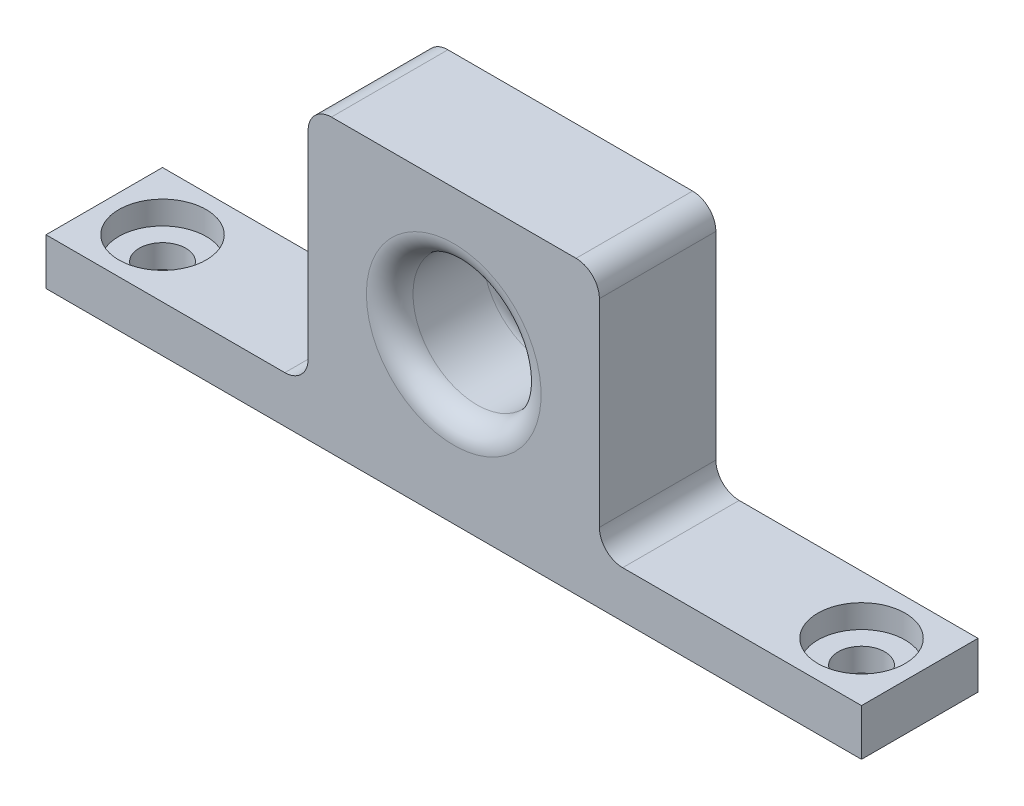
ISO-10303-21;
HEADER;
FILE_DESCRIPTION(('STEP AP214'),'2;1');
FILE_NAME('part.step','',(''),(''),'','','');
FILE_SCHEMA(('AUTOMOTIVE_DESIGN { 1 0 10303 214 1 1 1 1 }'));
ENDSEC;
DATA;
#1=APPLICATION_CONTEXT('core data for automotive mechanical design processes');
#2=APPLICATION_PROTOCOL_DEFINITION('international standard','automotive_design',2000,#1);
#3=PRODUCT_CONTEXT('',#1,'mechanical');
#4=PRODUCT('Part','Part','',(#3));
#5=PRODUCT_RELATED_PRODUCT_CATEGORY('part','',(#4));
#6=PRODUCT_DEFINITION_FORMATION('','',#4);
#7=PRODUCT_DEFINITION_CONTEXT('part definition',#1,'design');
#8=PRODUCT_DEFINITION('design','',#6,#7);
#9=PRODUCT_DEFINITION_SHAPE('','',#8);
#10=(LENGTH_UNIT() NAMED_UNIT(*) SI_UNIT(.MILLI.,.METRE.));
#11=(NAMED_UNIT(*) PLANE_ANGLE_UNIT() SI_UNIT($,.RADIAN.));
#12=(NAMED_UNIT(*) SI_UNIT($,.STERADIAN.) SOLID_ANGLE_UNIT());
#13=UNCERTAINTY_MEASURE_WITH_UNIT(LENGTH_MEASURE(1.E-05),#10,'distance_accuracy_value','');
#14=(GEOMETRIC_REPRESENTATION_CONTEXT(3) GLOBAL_UNCERTAINTY_ASSIGNED_CONTEXT((#13)) GLOBAL_UNIT_ASSIGNED_CONTEXT((#10,
#11,#12)) REPRESENTATION_CONTEXT('',''));
#15=CARTESIAN_POINT('',(0.,0.,0.));
#16=DIRECTION('',(0.,0.,1.));
#17=DIRECTION('',(1.,0.,0.));
#18=AXIS2_PLACEMENT_3D('',#15,#16,#17);
#19=CARTESIAN_POINT('',(0.,5.08,0.));
#20=DIRECTION('',(0.,-1.,0.));
#21=DIRECTION('',(0.,0.,-1.));
#22=AXIS2_PLACEMENT_3D('',#19,#20,#21);
#23=PLANE('',#22);
#24=CARTESIAN_POINT('',(6.34999999999999,5.08,-6.35));
#25=DIRECTION('',(0.,1.,0.));
#26=DIRECTION('',(0.,0.,1.));
#27=AXIS2_PLACEMENT_3D('',#24,#25,#26);
#28=CIRCLE('',#27,4.7625);
#29=CARTESIAN_POINT('',(6.34999999999999,5.08,-1.5875));
#30=VERTEX_POINT('',#29);
#31=EDGE_CURVE('E285',#30,#30,#28,.T.);
#32=ORIENTED_EDGE('',*,*,#31,.F.);
#33=EDGE_LOOP('',(#32));
#34=FACE_BOUND('',#33,.T.);
#35=DIRECTION('',(1.,0.,0.));
#36=VECTOR('',#35,1.);
#37=CARTESIAN_POINT('',(0.,5.08,0.));
#38=LINE('',#37,#36);
#39=CARTESIAN_POINT('',(0.,5.08,0.));
#40=VERTEX_POINT('',#39);
#41=CARTESIAN_POINT('',(26.035,5.08,0.));
#42=VERTEX_POINT('',#41);
#43=EDGE_CURVE('E129',#40,#42,#38,.T.);
#44=ORIENTED_EDGE('',*,*,#43,.T.);
#45=DIRECTION('',(0.,0.,-1.));
#46=VECTOR('',#45,1.);
#47=CARTESIAN_POINT('',(26.035,5.08,0.));
#48=LINE('',#47,#46);
#49=CARTESIAN_POINT('',(26.035,5.08,-12.7));
#50=VERTEX_POINT('',#49);
#51=EDGE_CURVE('E207',#42,#50,#48,.T.);
#52=ORIENTED_EDGE('',*,*,#51,.T.);
#53=DIRECTION('',(-1.,0.,0.));
#54=VECTOR('',#53,1.);
#55=CARTESIAN_POINT('',(0.,5.08,-12.7));
#56=LINE('',#55,#54);
#57=CARTESIAN_POINT('',(0.,5.08,-12.7));
#58=VERTEX_POINT('',#57);
#59=EDGE_CURVE('E147',#50,#58,#56,.T.);
#60=ORIENTED_EDGE('',*,*,#59,.T.);
#61=DIRECTION('',(0.,0.,1.));
#62=VECTOR('',#61,1.);
#63=CARTESIAN_POINT('',(0.,5.08,0.));
#64=LINE('',#63,#62);
#65=EDGE_CURVE('E145',#58,#40,#64,.T.);
#66=ORIENTED_EDGE('',*,*,#65,.T.);
#67=EDGE_LOOP('',(#44,#52,#60,#66));
#68=FACE_BOUND('',#67,.T.);
#69=ADVANCED_FACE('F39',(#34,#68),#23,.F.);
#70=CARTESIAN_POINT('',(6.34999999999999,5.08,-6.35));
#71=DIRECTION('',(0.,-1.,0.));
#72=DIRECTION('',(0.,0.,-1.));
#73=AXIS2_PLACEMENT_3D('',#70,#71,#72);
#74=CYLINDRICAL_SURFACE('',#73,2.54);
#75=CARTESIAN_POINT('',(6.34999999999999,0.,-6.35));
#76=DIRECTION('',(0.,1.,0.));
#77=DIRECTION('',(0.,0.,1.));
#78=AXIS2_PLACEMENT_3D('',#75,#76,#77);
#79=CIRCLE('',#78,2.54);
#80=CARTESIAN_POINT('',(6.34999999999999,0.,-3.81));
#81=VERTEX_POINT('',#80);
#82=EDGE_CURVE('E295',#81,#81,#79,.T.);
#83=ORIENTED_EDGE('',*,*,#82,.F.);
#84=EDGE_LOOP('',(#83));
#85=FACE_BOUND('',#84,.T.);
#86=CARTESIAN_POINT('',(6.34999999999999,2.54,-6.35));
#87=DIRECTION('',(0.,1.,0.));
#88=DIRECTION('',(0.,0.,1.));
#89=AXIS2_PLACEMENT_3D('',#86,#87,#88);
#90=CIRCLE('',#89,2.54);
#91=CARTESIAN_POINT('',(6.34999999999999,2.54,-3.81));
#92=VERTEX_POINT('',#91);
#93=EDGE_CURVE('E170',#92,#92,#90,.T.);
#94=ORIENTED_EDGE('',*,*,#93,.T.);
#95=EDGE_LOOP('',(#94));
#96=FACE_BOUND('',#95,.T.);
#97=ADVANCED_FACE('F233',(#85,#96),#74,.F.);
#98=CARTESIAN_POINT('',(82.55,5.08,-6.35));
#99=DIRECTION('',(0.,-1.,0.));
#100=DIRECTION('',(0.,0.,-1.));
#101=AXIS2_PLACEMENT_3D('',#98,#99,#100);
#102=CYLINDRICAL_SURFACE('',#101,2.54);
#103=CARTESIAN_POINT('',(82.55,0.,-6.35));
#104=DIRECTION('',(0.,1.,0.));
#105=DIRECTION('',(0.,0.,1.));
#106=AXIS2_PLACEMENT_3D('',#103,#104,#105);
#107=CIRCLE('',#106,2.54);
#108=CARTESIAN_POINT('',(82.55,0.,-3.81));
#109=VERTEX_POINT('',#108);
#110=EDGE_CURVE('E173',#109,#109,#107,.T.);
#111=ORIENTED_EDGE('',*,*,#110,.F.);
#112=EDGE_LOOP('',(#111));
#113=FACE_BOUND('',#112,.T.);
#114=CARTESIAN_POINT('',(82.55,2.54,-6.35));
#115=DIRECTION('',(0.,1.,0.));
#116=DIRECTION('',(0.,0.,1.));
#117=AXIS2_PLACEMENT_3D('',#114,#115,#116);
#118=CIRCLE('',#117,2.54);
#119=CARTESIAN_POINT('',(82.55,2.54,-3.81));
#120=VERTEX_POINT('',#119);
#121=EDGE_CURVE('E167',#120,#120,#118,.T.);
#122=ORIENTED_EDGE('',*,*,#121,.T.);
#123=EDGE_LOOP('',(#122));
#124=FACE_BOUND('',#123,.T.);
#125=ADVANCED_FACE('F240',(#113,#124),#102,.F.);
#126=CARTESIAN_POINT('',(82.55,5.08,-6.35));
#127=DIRECTION('',(0.,1.,0.));
#128=DIRECTION('',(0.,0.,1.));
#129=AXIS2_PLACEMENT_3D('',#126,#127,#128);
#130=CIRCLE('',#129,4.7625);
#131=CARTESIAN_POINT('',(82.55,5.08,-1.5875));
#132=VERTEX_POINT('',#131);
#133=EDGE_CURVE('E258',#132,#132,#130,.T.);
#134=ORIENTED_EDGE('',*,*,#133,.F.);
#135=EDGE_LOOP('',(#134));
#136=FACE_BOUND('',#135,.T.);
#137=CARTESIAN_POINT('',(88.9,5.08,-12.7));
#138=VERTEX_POINT('',#137);
#139=CARTESIAN_POINT('',(62.865,5.08,-12.7));
#140=VERTEX_POINT('',#139);
#141=EDGE_CURVE('E259',#138,#140,#56,.T.);
#142=ORIENTED_EDGE('',*,*,#141,.T.);
#143=DIRECTION('',(0.,0.,1.));
#144=VECTOR('',#143,1.);
#145=CARTESIAN_POINT('',(62.865,5.08,0.));
#146=LINE('',#145,#144);
#147=CARTESIAN_POINT('',(62.865,5.08,0.));
#148=VERTEX_POINT('',#147);
#149=EDGE_CURVE('E190',#140,#148,#146,.T.);
#150=ORIENTED_EDGE('',*,*,#149,.T.);
#151=CARTESIAN_POINT('',(88.9,5.08,0.));
#152=VERTEX_POINT('',#151);
#153=EDGE_CURVE('E142',#148,#152,#38,.T.);
#154=ORIENTED_EDGE('',*,*,#153,.T.);
#155=DIRECTION('',(0.,0.,-1.));
#156=VECTOR('',#155,1.);
#157=CARTESIAN_POINT('',(88.9,5.08,0.));
#158=LINE('',#157,#156);
#159=EDGE_CURVE('E141',#152,#138,#158,.T.);
#160=ORIENTED_EDGE('',*,*,#159,.T.);
#161=EDGE_LOOP('',(#142,#150,#154,#160));
#162=FACE_BOUND('',#161,.T.);
#163=ADVANCED_FACE('F236',(#136,#162),#23,.F.);
#164=CARTESIAN_POINT('',(0.,0.,0.));
#165=DIRECTION('',(0.,-1.,0.));
#166=DIRECTION('',(0.,0.,-1.));
#167=AXIS2_PLACEMENT_3D('',#164,#165,#166);
#168=PLANE('',#167);
#169=DIRECTION('',(0.,0.,-1.));
#170=VECTOR('',#169,1.);
#171=CARTESIAN_POINT('',(88.9,0.,0.));
#172=LINE('',#171,#170);
#173=CARTESIAN_POINT('',(88.9,0.,0.));
#174=VERTEX_POINT('',#173);
#175=CARTESIAN_POINT('',(88.9,0.,-12.7));
#176=VERTEX_POINT('',#175);
#177=EDGE_CURVE('E302',#174,#176,#172,.T.);
#178=ORIENTED_EDGE('',*,*,#177,.F.);
#179=DIRECTION('',(1.,0.,0.));
#180=VECTOR('',#179,1.);
#181=CARTESIAN_POINT('',(0.,0.,0.));
#182=LINE('',#181,#180);
#183=CARTESIAN_POINT('',(0.,0.,0.));
#184=VERTEX_POINT('',#183);
#185=EDGE_CURVE('E300',#184,#174,#182,.T.);
#186=ORIENTED_EDGE('',*,*,#185,.F.);
#187=DIRECTION('',(0.,0.,1.));
#188=VECTOR('',#187,1.);
#189=CARTESIAN_POINT('',(0.,0.,0.));
#190=LINE('',#189,#188);
#191=CARTESIAN_POINT('',(0.,0.,-12.7));
#192=VERTEX_POINT('',#191);
#193=EDGE_CURVE('E155',#192,#184,#190,.T.);
#194=ORIENTED_EDGE('',*,*,#193,.F.);
#195=DIRECTION('',(-1.,0.,0.));
#196=VECTOR('',#195,1.);
#197=CARTESIAN_POINT('',(0.,0.,-12.7));
#198=LINE('',#197,#196);
#199=EDGE_CURVE('E151',#176,#192,#198,.T.);
#200=ORIENTED_EDGE('',*,*,#199,.F.);
#201=EDGE_LOOP('',(#178,#186,#194,#200));
#202=FACE_BOUND('',#201,.T.);
#203=ORIENTED_EDGE('',*,*,#110,.T.);
#204=EDGE_LOOP('',(#203));
#205=FACE_BOUND('',#204,.T.);
#206=ORIENTED_EDGE('',*,*,#82,.T.);
#207=EDGE_LOOP('',(#206));
#208=FACE_BOUND('',#207,.T.);
#209=ADVANCED_FACE('F246',(#202,#205,#208),#168,.T.);
#210=CARTESIAN_POINT('',(0.,5.08,0.));
#211=DIRECTION('',(1.,0.,0.));
#212=DIRECTION('',(0.,0.,-1.));
#213=AXIS2_PLACEMENT_3D('',#210,#211,#212);
#214=PLANE('',#213);
#215=ORIENTED_EDGE('',*,*,#193,.T.);
#216=DIRECTION('',(0.,-1.,0.));
#217=VECTOR('',#216,1.);
#218=CARTESIAN_POINT('',(0.,5.08,0.));
#219=LINE('',#218,#217);
#220=EDGE_CURVE('E134',#40,#184,#219,.T.);
#221=ORIENTED_EDGE('',*,*,#220,.F.);
#222=ORIENTED_EDGE('',*,*,#65,.F.);
#223=DIRECTION('',(0.,-1.,0.));
#224=VECTOR('',#223,1.);
#225=CARTESIAN_POINT('',(0.,5.08,-12.7));
#226=LINE('',#225,#224);
#227=EDGE_CURVE('E265',#58,#192,#226,.T.);
#228=ORIENTED_EDGE('',*,*,#227,.T.);
#229=EDGE_LOOP('',(#215,#221,#222,#228));
#230=FACE_BOUND('',#229,.T.);
#231=ADVANCED_FACE('F153',(#230),#214,.F.);
#232=CARTESIAN_POINT('',(0.,5.08,0.));
#233=DIRECTION('',(0.,0.,-1.));
#234=DIRECTION('',(-1.,0.,0.));
#235=AXIS2_PLACEMENT_3D('',#232,#233,#234);
#236=PLANE('',#235);
#237=CARTESIAN_POINT('',(44.45,16.9545,0.));
#238=DIRECTION('',(0.,0.,-1.));
#239=DIRECTION('',(-1.,0.,0.));
#240=AXIS2_PLACEMENT_3D('',#237,#238,#239);
#241=CIRCLE('',#240,9.525);
#242=CARTESIAN_POINT('',(34.925,16.9545,0.));
#243=VERTEX_POINT('',#242);
#244=EDGE_CURVE('E181',#243,#243,#241,.T.);
#245=ORIENTED_EDGE('',*,*,#244,.T.);
#246=EDGE_LOOP('',(#245));
#247=FACE_BOUND('',#246,.T.);
#248=DIRECTION('',(0.,1.,0.));
#249=VECTOR('',#248,1.);
#250=CARTESIAN_POINT('',(60.325,31.75,0.));
#251=LINE('',#250,#249);
#252=CARTESIAN_POINT('',(60.325,7.62,0.));
#253=VERTEX_POINT('',#252);
#254=CARTESIAN_POINT('',(60.325,29.21,0.));
#255=VERTEX_POINT('',#254);
#256=EDGE_CURVE('E271',#253,#255,#251,.T.);
#257=ORIENTED_EDGE('',*,*,#256,.T.);
#258=CARTESIAN_POINT('',(57.785,29.21,0.));
#259=DIRECTION('',(0.,0.,-1.));
#260=DIRECTION('',(-1.,0.,0.));
#261=AXIS2_PLACEMENT_3D('',#258,#259,#260);
#262=CIRCLE('',#261,2.54);
#263=CARTESIAN_POINT('',(57.785,31.75,0.));
#264=VERTEX_POINT('',#263);
#265=EDGE_CURVE('E179',#255,#264,#262,.F.);
#266=ORIENTED_EDGE('',*,*,#265,.T.);
#267=DIRECTION('',(-1.,0.,0.));
#268=VECTOR('',#267,1.);
#269=CARTESIAN_POINT('',(28.575,31.75,0.));
#270=LINE('',#269,#268);
#271=CARTESIAN_POINT('',(31.115,31.75,0.));
#272=VERTEX_POINT('',#271);
#273=EDGE_CURVE('E223',#264,#272,#270,.T.);
#274=ORIENTED_EDGE('',*,*,#273,.T.);
#275=CARTESIAN_POINT('',(31.115,29.21,0.));
#276=DIRECTION('',(0.,0.,-1.));
#277=DIRECTION('',(-1.,0.,0.));
#278=AXIS2_PLACEMENT_3D('',#275,#276,#277);
#279=CIRCLE('',#278,2.54);
#280=CARTESIAN_POINT('',(28.575,29.21,0.));
#281=VERTEX_POINT('',#280);
#282=EDGE_CURVE('E177',#272,#281,#279,.F.);
#283=ORIENTED_EDGE('',*,*,#282,.T.);
#284=DIRECTION('',(0.,-1.,0.));
#285=VECTOR('',#284,1.);
#286=CARTESIAN_POINT('',(28.575,31.75,0.));
#287=LINE('',#286,#285);
#288=CARTESIAN_POINT('',(28.575,7.62,0.));
#289=VERTEX_POINT('',#288);
#290=EDGE_CURVE('E276',#281,#289,#287,.T.);
#291=ORIENTED_EDGE('',*,*,#290,.T.);
#292=CARTESIAN_POINT('',(26.035,7.62,0.));
#293=DIRECTION('',(0.,0.,-1.));
#294=DIRECTION('',(-1.,0.,0.));
#295=AXIS2_PLACEMENT_3D('',#292,#293,#294);
#296=CIRCLE('',#295,2.54);
#297=EDGE_CURVE('E11',#289,#42,#296,.T.);
#298=ORIENTED_EDGE('',*,*,#297,.T.);
#299=ORIENTED_EDGE('',*,*,#43,.F.);
#300=ORIENTED_EDGE('',*,*,#220,.T.);
#301=ORIENTED_EDGE('',*,*,#185,.T.);
#302=DIRECTION('',(0.,-1.,0.));
#303=VECTOR('',#302,1.);
#304=CARTESIAN_POINT('',(88.9,5.08,0.));
#305=LINE('',#304,#303);
#306=EDGE_CURVE('E157',#152,#174,#305,.T.);
#307=ORIENTED_EDGE('',*,*,#306,.F.);
#308=ORIENTED_EDGE('',*,*,#153,.F.);
#309=CARTESIAN_POINT('',(62.865,7.62,0.));
#310=DIRECTION('',(0.,0.,-1.));
#311=DIRECTION('',(-1.,0.,0.));
#312=AXIS2_PLACEMENT_3D('',#309,#310,#311);
#313=CIRCLE('',#312,2.54);
#314=EDGE_CURVE('E209',#148,#253,#313,.T.);
#315=ORIENTED_EDGE('',*,*,#314,.T.);
#316=EDGE_LOOP('',(#257,#266,#274,#283,#291,#298,#299,#300,#301,#307,#308,#315));
#317=FACE_BOUND('',#316,.T.);
#318=ADVANCED_FACE('F132',(#247,#317),#236,.F.);
#319=CARTESIAN_POINT('',(88.9,5.08,0.));
#320=DIRECTION('',(-1.,0.,0.));
#321=DIRECTION('',(0.,0.,1.));
#322=AXIS2_PLACEMENT_3D('',#319,#320,#321);
#323=PLANE('',#322);
#324=ORIENTED_EDGE('',*,*,#177,.T.);
#325=DIRECTION('',(0.,-1.,0.));
#326=VECTOR('',#325,1.);
#327=CARTESIAN_POINT('',(88.9,5.08,-12.7));
#328=LINE('',#327,#326);
#329=EDGE_CURVE('E163',#138,#176,#328,.T.);
#330=ORIENTED_EDGE('',*,*,#329,.F.);
#331=ORIENTED_EDGE('',*,*,#159,.F.);
#332=ORIENTED_EDGE('',*,*,#306,.T.);
#333=EDGE_LOOP('',(#324,#330,#331,#332));
#334=FACE_BOUND('',#333,.T.);
#335=ADVANCED_FACE('F309',(#334),#323,.F.);
#336=CARTESIAN_POINT('',(0.,5.08,-12.7));
#337=DIRECTION('',(0.,0.,1.));
#338=DIRECTION('',(1.,0.,0.));
#339=AXIS2_PLACEMENT_3D('',#336,#337,#338);
#340=PLANE('',#339);
#341=CARTESIAN_POINT('',(44.45,16.9545,-12.7));
#342=DIRECTION('',(0.,0.,1.));
#343=DIRECTION('',(1.,0.,0.));
#344=AXIS2_PLACEMENT_3D('',#341,#342,#343);
#345=CIRCLE('',#344,9.525);
#346=CARTESIAN_POINT('',(53.975,16.9545,-12.7));
#347=VERTEX_POINT('',#346);
#348=EDGE_CURVE('E187',#347,#347,#345,.T.);
#349=ORIENTED_EDGE('',*,*,#348,.T.);
#350=EDGE_LOOP('',(#349));
#351=FACE_BOUND('',#350,.T.);
#352=DIRECTION('',(-1.,0.,0.));
#353=VECTOR('',#352,1.);
#354=CARTESIAN_POINT('',(28.575,31.75,-12.7));
#355=LINE('',#354,#353);
#356=CARTESIAN_POINT('',(57.785,31.75,-12.7));
#357=VERTEX_POINT('',#356);
#358=CARTESIAN_POINT('',(31.115,31.75,-12.7));
#359=VERTEX_POINT('',#358);
#360=EDGE_CURVE('E292',#357,#359,#355,.T.);
#361=ORIENTED_EDGE('',*,*,#360,.F.);
#362=CARTESIAN_POINT('',(57.785,29.21,-12.7));
#363=DIRECTION('',(0.,0.,1.));
#364=DIRECTION('',(1.,0.,0.));
#365=AXIS2_PLACEMENT_3D('',#362,#363,#364);
#366=CIRCLE('',#365,2.54);
#367=CARTESIAN_POINT('',(60.325,29.21,-12.7));
#368=VERTEX_POINT('',#367);
#369=EDGE_CURVE('E60',#357,#368,#366,.F.);
#370=ORIENTED_EDGE('',*,*,#369,.T.);
#371=DIRECTION('',(0.,1.,0.));
#372=VECTOR('',#371,1.);
#373=CARTESIAN_POINT('',(60.325,31.75,-12.7));
#374=LINE('',#373,#372);
#375=CARTESIAN_POINT('',(60.325,7.62,-12.7));
#376=VERTEX_POINT('',#375);
#377=EDGE_CURVE('E222',#376,#368,#374,.T.);
#378=ORIENTED_EDGE('',*,*,#377,.F.);
#379=CARTESIAN_POINT('',(62.865,7.62,-12.7));
#380=DIRECTION('',(0.,0.,1.));
#381=DIRECTION('',(1.,0.,0.));
#382=AXIS2_PLACEMENT_3D('',#379,#380,#381);
#383=CIRCLE('',#382,2.54);
#384=EDGE_CURVE('E54',#376,#140,#383,.T.);
#385=ORIENTED_EDGE('',*,*,#384,.T.);
#386=ORIENTED_EDGE('',*,*,#141,.F.);
#387=ORIENTED_EDGE('',*,*,#329,.T.);
#388=ORIENTED_EDGE('',*,*,#199,.T.);
#389=ORIENTED_EDGE('',*,*,#227,.F.);
#390=ORIENTED_EDGE('',*,*,#59,.F.);
#391=CARTESIAN_POINT('',(26.035,7.62,-12.7));
#392=DIRECTION('',(0.,0.,1.));
#393=DIRECTION('',(1.,0.,0.));
#394=AXIS2_PLACEMENT_3D('',#391,#392,#393);
#395=CIRCLE('',#394,2.54);
#396=CARTESIAN_POINT('',(28.575,7.62,-12.7));
#397=VERTEX_POINT('',#396);
#398=EDGE_CURVE('E47',#50,#397,#395,.T.);
#399=ORIENTED_EDGE('',*,*,#398,.T.);
#400=DIRECTION('',(0.,-1.,0.));
#401=VECTOR('',#400,1.);
#402=CARTESIAN_POINT('',(28.575,31.75,-12.7));
#403=LINE('',#402,#401);
#404=CARTESIAN_POINT('',(28.575,29.21,-12.7));
#405=VERTEX_POINT('',#404);
#406=EDGE_CURVE('E214',#405,#397,#403,.T.);
#407=ORIENTED_EDGE('',*,*,#406,.F.);
#408=CARTESIAN_POINT('',(31.115,29.21,-12.7));
#409=DIRECTION('',(0.,0.,1.));
#410=DIRECTION('',(1.,0.,0.));
#411=AXIS2_PLACEMENT_3D('',#408,#409,#410);
#412=CIRCLE('',#411,2.54);
#413=EDGE_CURVE('E184',#405,#359,#412,.F.);
#414=ORIENTED_EDGE('',*,*,#413,.T.);
#415=EDGE_LOOP('',(#361,#370,#378,#385,#386,#387,#388,#389,#390,#399,#407,#414));
#416=FACE_BOUND('',#415,.T.);
#417=ADVANCED_FACE('F213',(#351,#416),#340,.F.);
#418=CARTESIAN_POINT('',(82.55,2.54,-6.35));
#419=DIRECTION('',(0.,1.,0.));
#420=DIRECTION('',(0.,0.,1.));
#421=AXIS2_PLACEMENT_3D('',#418,#419,#420);
#422=CYLINDRICAL_SURFACE('',#421,4.7625);
#423=CARTESIAN_POINT('',(82.55,2.54,-6.35));
#424=DIRECTION('',(0.,1.,0.));
#425=DIRECTION('',(0.,0.,1.));
#426=AXIS2_PLACEMENT_3D('',#423,#424,#425);
#427=CIRCLE('',#426,4.7625);
#428=CARTESIAN_POINT('',(82.55,2.54,-1.5875));
#429=VERTEX_POINT('',#428);
#430=EDGE_CURVE('E289',#429,#429,#427,.T.);
#431=ORIENTED_EDGE('',*,*,#430,.F.);
#432=EDGE_LOOP('',(#431));
#433=FACE_BOUND('',#432,.T.);
#434=ORIENTED_EDGE('',*,*,#133,.T.);
#435=EDGE_LOOP('',(#434));
#436=FACE_BOUND('',#435,.T.);
#437=ADVANCED_FACE('F316',(#433,#436),#422,.F.);
#438=CARTESIAN_POINT('',(82.55,2.54,-6.35));
#439=DIRECTION('',(0.,1.,0.));
#440=DIRECTION('',(0.,0.,1.));
#441=AXIS2_PLACEMENT_3D('',#438,#439,#440);
#442=PLANE('',#441);
#443=ORIENTED_EDGE('',*,*,#121,.F.);
#444=EDGE_LOOP('',(#443));
#445=FACE_BOUND('',#444,.T.);
#446=ORIENTED_EDGE('',*,*,#430,.T.);
#447=EDGE_LOOP('',(#446));
#448=FACE_BOUND('',#447,.T.);
#449=ADVANCED_FACE('F365',(#445,#448),#442,.T.);
#450=CARTESIAN_POINT('',(6.34999999999999,2.54,-6.35));
#451=DIRECTION('',(0.,1.,0.));
#452=DIRECTION('',(0.,0.,1.));
#453=AXIS2_PLACEMENT_3D('',#450,#451,#452);
#454=CYLINDRICAL_SURFACE('',#453,4.7625);
#455=CARTESIAN_POINT('',(6.34999999999999,2.54,-6.35));
#456=DIRECTION('',(0.,1.,0.));
#457=DIRECTION('',(0.,0.,1.));
#458=AXIS2_PLACEMENT_3D('',#455,#456,#457);
#459=CIRCLE('',#458,4.7625);
#460=CARTESIAN_POINT('',(6.34999999999999,2.54,-1.5875));
#461=VERTEX_POINT('',#460);
#462=EDGE_CURVE('E171',#461,#461,#459,.T.);
#463=ORIENTED_EDGE('',*,*,#462,.F.);
#464=EDGE_LOOP('',(#463));
#465=FACE_BOUND('',#464,.T.);
#466=ORIENTED_EDGE('',*,*,#31,.T.);
#467=EDGE_LOOP('',(#466));
#468=FACE_BOUND('',#467,.T.);
#469=ADVANCED_FACE('F361',(#465,#468),#454,.F.);
#470=CARTESIAN_POINT('',(6.34999999999999,2.54,-6.35));
#471=DIRECTION('',(0.,1.,0.));
#472=DIRECTION('',(0.,0.,1.));
#473=AXIS2_PLACEMENT_3D('',#470,#471,#472);
#474=PLANE('',#473);
#475=ORIENTED_EDGE('',*,*,#93,.F.);
#476=EDGE_LOOP('',(#475));
#477=FACE_BOUND('',#476,.T.);
#478=ORIENTED_EDGE('',*,*,#462,.T.);
#479=EDGE_LOOP('',(#478));
#480=FACE_BOUND('',#479,.T.);
#481=ADVANCED_FACE('F358',(#477,#480),#474,.T.);
#482=CARTESIAN_POINT('',(28.575,31.75,-12.7));
#483=DIRECTION('',(-1.,0.,0.));
#484=DIRECTION('',(0.,-1.,0.));
#485=AXIS2_PLACEMENT_3D('',#482,#483,#484);
#486=PLANE('',#485);
#487=ORIENTED_EDGE('',*,*,#290,.F.);
#488=DIRECTION('',(0.,0.,1.));
#489=VECTOR('',#488,1.);
#490=CARTESIAN_POINT('',(28.575,29.21,-12.7));
#491=LINE('',#490,#489);
#492=EDGE_CURVE('E205',#281,#405,#491,.F.);
#493=ORIENTED_EDGE('',*,*,#492,.T.);
#494=ORIENTED_EDGE('',*,*,#406,.T.);
#495=DIRECTION('',(0.,0.,-1.));
#496=VECTOR('',#495,1.);
#497=CARTESIAN_POINT('',(28.575,7.62,-12.7));
#498=LINE('',#497,#496);
#499=EDGE_CURVE('E203',#397,#289,#498,.F.);
#500=ORIENTED_EDGE('',*,*,#499,.T.);
#501=EDGE_LOOP('',(#487,#493,#494,#500));
#502=FACE_BOUND('',#501,.T.);
#503=ADVANCED_FACE('F220',(#502),#486,.T.);
#504=CARTESIAN_POINT('',(60.325,31.75,-12.7));
#505=DIRECTION('',(1.,0.,0.));
#506=DIRECTION('',(0.,1.,0.));
#507=AXIS2_PLACEMENT_3D('',#504,#505,#506);
#508=PLANE('',#507);
#509=ORIENTED_EDGE('',*,*,#256,.F.);
#510=DIRECTION('',(0.,0.,1.));
#511=VECTOR('',#510,1.);
#512=CARTESIAN_POINT('',(60.325,7.62,-12.7));
#513=LINE('',#512,#511);
#514=EDGE_CURVE('E196',#253,#376,#513,.F.);
#515=ORIENTED_EDGE('',*,*,#514,.T.);
#516=ORIENTED_EDGE('',*,*,#377,.T.);
#517=DIRECTION('',(0.,0.,1.));
#518=VECTOR('',#517,1.);
#519=CARTESIAN_POINT('',(60.325,29.21,-12.7));
#520=LINE('',#519,#518);
#521=EDGE_CURVE('E193',#368,#255,#520,.T.);
#522=ORIENTED_EDGE('',*,*,#521,.T.);
#523=EDGE_LOOP('',(#509,#515,#516,#522));
#524=FACE_BOUND('',#523,.T.);
#525=ADVANCED_FACE('F274',(#524),#508,.T.);
#526=CARTESIAN_POINT('',(28.575,31.75,-12.7));
#527=DIRECTION('',(0.,1.,0.));
#528=DIRECTION('',(0.,0.,1.));
#529=AXIS2_PLACEMENT_3D('',#526,#527,#528);
#530=PLANE('',#529);
#531=ORIENTED_EDGE('',*,*,#273,.F.);
#532=DIRECTION('',(0.,0.,1.));
#533=VECTOR('',#532,1.);
#534=CARTESIAN_POINT('',(57.785,31.75,-12.7));
#535=LINE('',#534,#533);
#536=EDGE_CURVE('E201',#264,#357,#535,.F.);
#537=ORIENTED_EDGE('',*,*,#536,.T.);
#538=ORIENTED_EDGE('',*,*,#360,.T.);
#539=DIRECTION('',(0.,0.,1.));
#540=VECTOR('',#539,1.);
#541=CARTESIAN_POINT('',(31.115,31.75,-12.7));
#542=LINE('',#541,#540);
#543=EDGE_CURVE('E198',#359,#272,#542,.T.);
#544=ORIENTED_EDGE('',*,*,#543,.T.);
#545=EDGE_LOOP('',(#531,#537,#538,#544));
#546=FACE_BOUND('',#545,.T.);
#547=ADVANCED_FACE('F342',(#546),#530,.T.);
#548=CARTESIAN_POINT('',(44.45,16.9545,-12.7));
#549=DIRECTION('',(0.,0.,1.));
#550=DIRECTION('',(1.,0.,0.));
#551=AXIS2_PLACEMENT_3D('',#548,#549,#550);
#552=CYLINDRICAL_SURFACE('',#551,6.985);
#553=CARTESIAN_POINT('',(44.45,16.9545,-2.54));
#554=DIRECTION('',(0.,0.,-1.));
#555=DIRECTION('',(-1.,0.,0.));
#556=AXIS2_PLACEMENT_3D('',#553,#554,#555);
#557=CIRCLE('',#556,6.985);
#558=CARTESIAN_POINT('',(37.465,16.9545,-2.54));
#559=VERTEX_POINT('',#558);
#560=EDGE_CURVE('E160',#559,#559,#557,.F.);
#561=ORIENTED_EDGE('',*,*,#560,.T.);
#562=EDGE_LOOP('',(#561));
#563=FACE_BOUND('',#562,.T.);
#564=CARTESIAN_POINT('',(44.45,16.9545,-10.16));
#565=DIRECTION('',(0.,0.,1.));
#566=DIRECTION('',(1.,0.,0.));
#567=AXIS2_PLACEMENT_3D('',#564,#565,#566);
#568=CIRCLE('',#567,6.985);
#569=CARTESIAN_POINT('',(51.435,16.9545,-10.16));
#570=VERTEX_POINT('',#569);
#571=EDGE_CURVE('E156',#570,#570,#568,.F.);
#572=ORIENTED_EDGE('',*,*,#571,.T.);
#573=EDGE_LOOP('',(#572));
#574=FACE_BOUND('',#573,.T.);
#575=ADVANCED_FACE('F328',(#563,#574),#552,.F.);
#576=CARTESIAN_POINT('',(44.45,16.9545,-2.54));
#577=DIRECTION('',(0.,0.,-1.));
#578=DIRECTION('',(-1.,0.,0.));
#579=AXIS2_PLACEMENT_3D('',#576,#577,#578);
#580=TOROIDAL_SURFACE('',#579,9.525,2.54);
#581=ORIENTED_EDGE('',*,*,#244,.F.);
#582=EDGE_LOOP('',(#581));
#583=FACE_BOUND('',#582,.T.);
#584=ORIENTED_EDGE('',*,*,#560,.F.);
#585=EDGE_LOOP('',(#584));
#586=FACE_BOUND('',#585,.T.);
#587=ADVANCED_FACE('F324',(#583,#586),#580,.T.);
#588=CARTESIAN_POINT('',(44.45,16.9545,-10.16));
#589=DIRECTION('',(0.,0.,1.));
#590=DIRECTION('',(1.,0.,0.));
#591=AXIS2_PLACEMENT_3D('',#588,#589,#590);
#592=TOROIDAL_SURFACE('',#591,9.525,2.54);
#593=ORIENTED_EDGE('',*,*,#571,.F.);
#594=EDGE_LOOP('',(#593));
#595=FACE_BOUND('',#594,.T.);
#596=ORIENTED_EDGE('',*,*,#348,.F.);
#597=EDGE_LOOP('',(#596));
#598=FACE_BOUND('',#597,.T.);
#599=ADVANCED_FACE('F327',(#595,#598),#592,.T.);
#600=CARTESIAN_POINT('',(62.865,7.62,0.));
#601=DIRECTION('',(0.,0.,1.));
#602=DIRECTION('',(1.,0.,0.));
#603=AXIS2_PLACEMENT_3D('',#600,#601,#602);
#604=CYLINDRICAL_SURFACE('',#603,2.54);
#605=ORIENTED_EDGE('',*,*,#384,.F.);
#606=ORIENTED_EDGE('',*,*,#514,.F.);
#607=ORIENTED_EDGE('',*,*,#314,.F.);
#608=ORIENTED_EDGE('',*,*,#149,.F.);
#609=EDGE_LOOP('',(#605,#606,#607,#608));
#610=FACE_BOUND('',#609,.T.);
#611=ADVANCED_FACE('F268',(#610),#604,.F.);
#612=CARTESIAN_POINT('',(57.785,29.21,-12.7));
#613=DIRECTION('',(0.,0.,1.));
#614=DIRECTION('',(1.,0.,0.));
#615=AXIS2_PLACEMENT_3D('',#612,#613,#614);
#616=CYLINDRICAL_SURFACE('',#615,2.54);
#617=ORIENTED_EDGE('',*,*,#369,.F.);
#618=ORIENTED_EDGE('',*,*,#536,.F.);
#619=ORIENTED_EDGE('',*,*,#265,.F.);
#620=ORIENTED_EDGE('',*,*,#521,.F.);
#621=EDGE_LOOP('',(#617,#618,#619,#620));
#622=FACE_BOUND('',#621,.T.);
#623=ADVANCED_FACE('F230',(#622),#616,.T.);
#624=CARTESIAN_POINT('',(31.115,29.21,-12.7));
#625=DIRECTION('',(0.,0.,1.));
#626=DIRECTION('',(1.,0.,0.));
#627=AXIS2_PLACEMENT_3D('',#624,#625,#626);
#628=CYLINDRICAL_SURFACE('',#627,2.54);
#629=ORIENTED_EDGE('',*,*,#413,.F.);
#630=ORIENTED_EDGE('',*,*,#492,.F.);
#631=ORIENTED_EDGE('',*,*,#282,.F.);
#632=ORIENTED_EDGE('',*,*,#543,.F.);
#633=EDGE_LOOP('',(#629,#630,#631,#632));
#634=FACE_BOUND('',#633,.T.);
#635=ADVANCED_FACE('F226',(#634),#628,.T.);
#636=CARTESIAN_POINT('',(26.035,7.62,0.));
#637=DIRECTION('',(0.,0.,-1.));
#638=DIRECTION('',(-1.,0.,0.));
#639=AXIS2_PLACEMENT_3D('',#636,#637,#638);
#640=CYLINDRICAL_SURFACE('',#639,2.54);
#641=ORIENTED_EDGE('',*,*,#297,.F.);
#642=ORIENTED_EDGE('',*,*,#499,.F.);
#643=ORIENTED_EDGE('',*,*,#398,.F.);
#644=ORIENTED_EDGE('',*,*,#51,.F.);
#645=EDGE_LOOP('',(#641,#642,#643,#644));
#646=FACE_BOUND('',#645,.T.);
#647=ADVANCED_FACE('F41',(#646),#640,.F.);
#648=CLOSED_SHELL('',(#69,#97,#125,#163,#209,#231,#318,#335,#417,#437,#449,#469,#481,#503,#525,
#547,#575,#587,#599,#611,#623,#635,#647));
#649=MANIFOLD_SOLID_BREP('B2',#648);
#650=ADVANCED_BREP_SHAPE_REPRESENTATION('',(#18,#649),#14);
#651=SHAPE_DEFINITION_REPRESENTATION(#9,#650);
ENDSEC;
END-ISO-10303-21;
